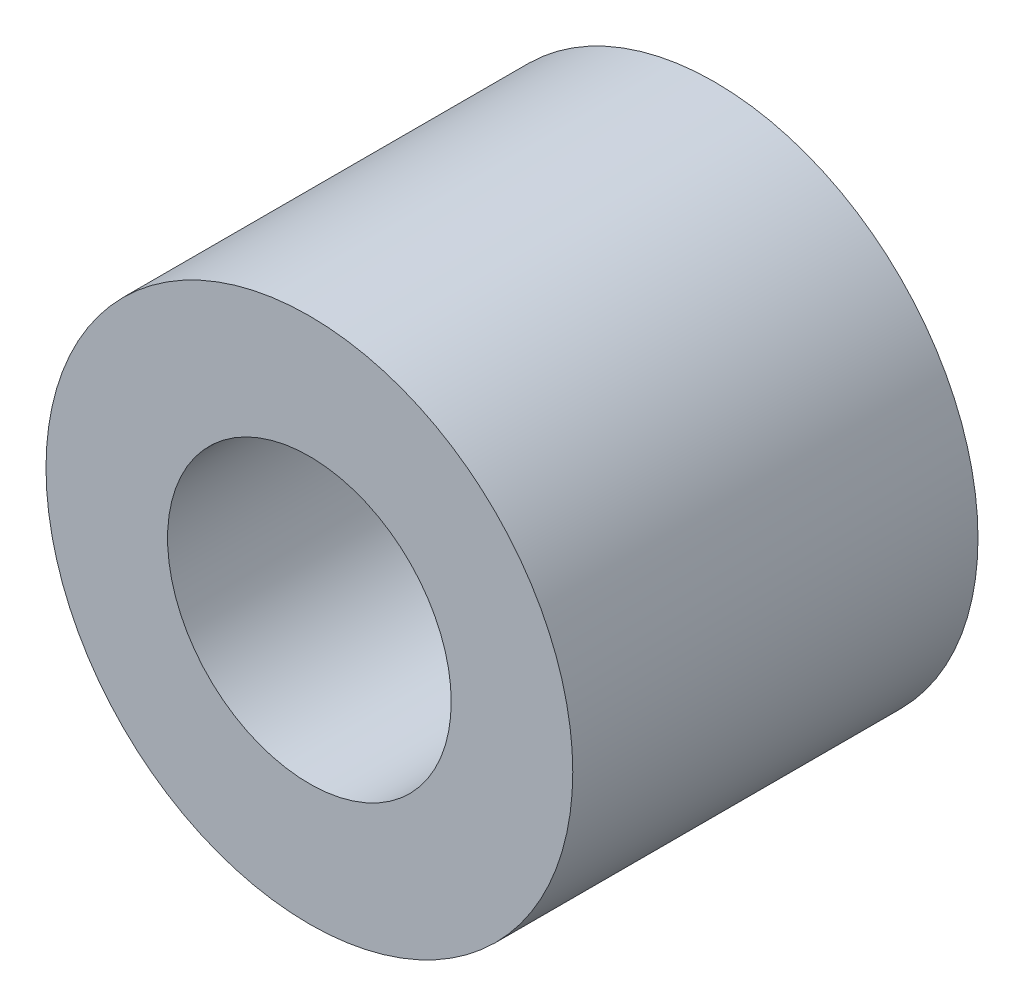
ISO-10303-21;
HEADER;
FILE_DESCRIPTION(('STEP AP214'),'2;1');
FILE_NAME('part.step','',(''),(''),'','','');
FILE_SCHEMA(('AUTOMOTIVE_DESIGN { 1 0 10303 214 1 1 1 1 }'));
ENDSEC;
DATA;
#1=APPLICATION_CONTEXT('core data for automotive mechanical design processes');
#2=APPLICATION_PROTOCOL_DEFINITION('international standard','automotive_design',2000,#1);
#3=PRODUCT_CONTEXT('',#1,'mechanical');
#4=PRODUCT('Part','Part','',(#3));
#5=PRODUCT_RELATED_PRODUCT_CATEGORY('part','',(#4));
#6=PRODUCT_DEFINITION_FORMATION('','',#4);
#7=PRODUCT_DEFINITION_CONTEXT('part definition',#1,'design');
#8=PRODUCT_DEFINITION('design','',#6,#7);
#9=PRODUCT_DEFINITION_SHAPE('','',#8);
#10=(LENGTH_UNIT() NAMED_UNIT(*) SI_UNIT(.MILLI.,.METRE.));
#11=(NAMED_UNIT(*) PLANE_ANGLE_UNIT() SI_UNIT($,.RADIAN.));
#12=(NAMED_UNIT(*) SI_UNIT($,.STERADIAN.) SOLID_ANGLE_UNIT());
#13=UNCERTAINTY_MEASURE_WITH_UNIT(LENGTH_MEASURE(1.E-05),#10,'distance_accuracy_value','');
#14=(GEOMETRIC_REPRESENTATION_CONTEXT(3) GLOBAL_UNCERTAINTY_ASSIGNED_CONTEXT((#13)) GLOBAL_UNIT_ASSIGNED_CONTEXT((#10,
#11,#12)) REPRESENTATION_CONTEXT('',''));
#15=CARTESIAN_POINT('',(0.,0.,0.));
#16=DIRECTION('',(0.,0.,1.));
#17=DIRECTION('',(1.,0.,0.));
#18=AXIS2_PLACEMENT_3D('',#15,#16,#17);
#19=CARTESIAN_POINT('',(0.,0.,5.));
#20=DIRECTION('',(0.,0.,1.));
#21=DIRECTION('',(1.,0.,0.));
#22=AXIS2_PLACEMENT_3D('',#19,#20,#21);
#23=PLANE('',#22);
#24=CARTESIAN_POINT('',(0.,0.,5.));
#25=DIRECTION('',(0.,0.,1.));
#26=DIRECTION('',(1.,0.,0.));
#27=AXIS2_PLACEMENT_3D('',#24,#25,#26);
#28=CIRCLE('',#27,3.25);
#29=CARTESIAN_POINT('',(3.25,0.,5.));
#30=VERTEX_POINT('',#29);
#31=EDGE_CURVE('E10',#30,#30,#28,.T.);
#32=ORIENTED_EDGE('',*,*,#31,.T.);
#33=EDGE_LOOP('',(#32));
#34=FACE_BOUND('',#33,.T.);
#35=CARTESIAN_POINT('',(0.,0.,5.));
#36=DIRECTION('',(0.,0.,1.));
#37=DIRECTION('',(1.,0.,0.));
#38=AXIS2_PLACEMENT_3D('',#35,#36,#37);
#39=CIRCLE('',#38,1.75);
#40=CARTESIAN_POINT('',(1.75,0.,5.));
#41=VERTEX_POINT('',#40);
#42=EDGE_CURVE('E44',#41,#41,#39,.T.);
#43=ORIENTED_EDGE('',*,*,#42,.F.);
#44=EDGE_LOOP('',(#43));
#45=FACE_BOUND('',#44,.T.);
#46=ADVANCED_FACE('F33',(#34,#45),#23,.T.);
#47=CARTESIAN_POINT('',(0.,0.,0.));
#48=DIRECTION('',(0.,0.,1.));
#49=DIRECTION('',(1.,0.,0.));
#50=AXIS2_PLACEMENT_3D('',#47,#48,#49);
#51=PLANE('',#50);
#52=CARTESIAN_POINT('',(0.,0.,0.));
#53=DIRECTION('',(0.,0.,1.));
#54=DIRECTION('',(1.,0.,0.));
#55=AXIS2_PLACEMENT_3D('',#52,#53,#54);
#56=CIRCLE('',#55,3.25);
#57=CARTESIAN_POINT('',(3.25,0.,0.));
#58=VERTEX_POINT('',#57);
#59=EDGE_CURVE('E37',#58,#58,#56,.T.);
#60=ORIENTED_EDGE('',*,*,#59,.F.);
#61=EDGE_LOOP('',(#60));
#62=FACE_BOUND('',#61,.T.);
#63=CARTESIAN_POINT('',(0.,0.,0.));
#64=DIRECTION('',(0.,0.,1.));
#65=DIRECTION('',(1.,0.,0.));
#66=AXIS2_PLACEMENT_3D('',#63,#64,#65);
#67=CIRCLE('',#66,1.75);
#68=CARTESIAN_POINT('',(1.75,0.,0.));
#69=VERTEX_POINT('',#68);
#70=EDGE_CURVE('E46',#69,#69,#67,.T.);
#71=ORIENTED_EDGE('',*,*,#70,.T.);
#72=EDGE_LOOP('',(#71));
#73=FACE_BOUND('',#72,.T.);
#74=ADVANCED_FACE('F56',(#62,#73),#51,.F.);
#75=CARTESIAN_POINT('',(0.,0.,5.));
#76=DIRECTION('',(0.,0.,-1.));
#77=DIRECTION('',(-1.,0.,0.));
#78=AXIS2_PLACEMENT_3D('',#75,#76,#77);
#79=CYLINDRICAL_SURFACE('',#78,3.25);
#80=ORIENTED_EDGE('',*,*,#31,.F.);
#81=EDGE_LOOP('',(#80));
#82=FACE_BOUND('',#81,.T.);
#83=ORIENTED_EDGE('',*,*,#59,.T.);
#84=EDGE_LOOP('',(#83));
#85=FACE_BOUND('',#84,.T.);
#86=ADVANCED_FACE('F35',(#82,#85),#79,.T.);
#87=CARTESIAN_POINT('',(0.,0.,5.));
#88=DIRECTION('',(0.,0.,-1.));
#89=DIRECTION('',(-1.,0.,0.));
#90=AXIS2_PLACEMENT_3D('',#87,#88,#89);
#91=CYLINDRICAL_SURFACE('',#90,1.75);
#92=ORIENTED_EDGE('',*,*,#42,.T.);
#93=EDGE_LOOP('',(#92));
#94=FACE_BOUND('',#93,.T.);
#95=ORIENTED_EDGE('',*,*,#70,.F.);
#96=EDGE_LOOP('',(#95));
#97=FACE_BOUND('',#96,.T.);
#98=ADVANCED_FACE('F52',(#94,#97),#91,.F.);
#99=CLOSED_SHELL('',(#46,#74,#86,#98));
#100=MANIFOLD_SOLID_BREP('B2',#99);
#101=ADVANCED_BREP_SHAPE_REPRESENTATION('',(#18,#100),#14);
#102=SHAPE_DEFINITION_REPRESENTATION(#9,#101);
ENDSEC;
END-ISO-10303-21;
